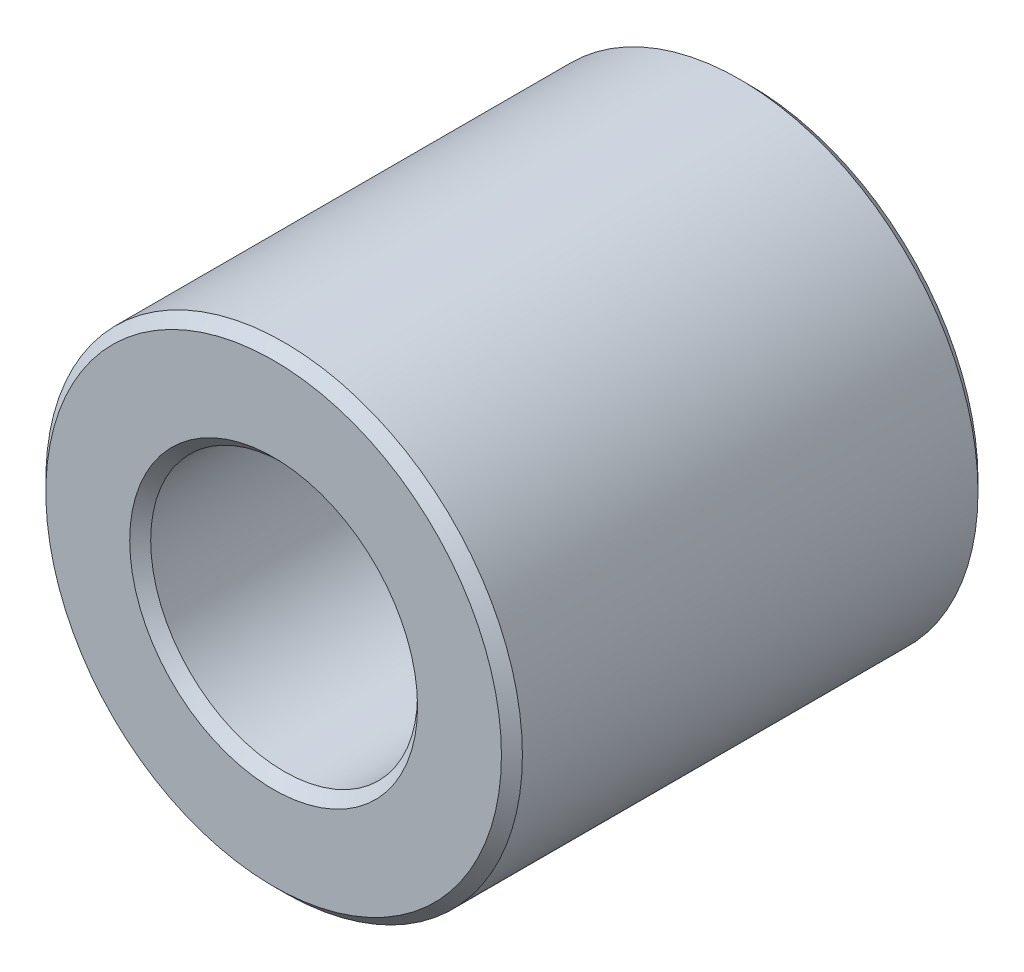
ISO-10303-21;
HEADER;
FILE_DESCRIPTION(('STEP AP214'),'2;1');
FILE_NAME('part.step','',(''),(''),'','','');
FILE_SCHEMA(('AUTOMOTIVE_DESIGN { 1 0 10303 214 1 1 1 1 }'));
ENDSEC;
DATA;
#1=APPLICATION_CONTEXT('core data for automotive mechanical design processes');
#2=APPLICATION_PROTOCOL_DEFINITION('international standard','automotive_design',2000,#1);
#3=PRODUCT_CONTEXT('',#1,'mechanical');
#4=PRODUCT('Part','Part','',(#3));
#5=PRODUCT_RELATED_PRODUCT_CATEGORY('part','',(#4));
#6=PRODUCT_DEFINITION_FORMATION('','',#4);
#7=PRODUCT_DEFINITION_CONTEXT('part definition',#1,'design');
#8=PRODUCT_DEFINITION('design','',#6,#7);
#9=PRODUCT_DEFINITION_SHAPE('','',#8);
#10=(LENGTH_UNIT() NAMED_UNIT(*) SI_UNIT(.MILLI.,.METRE.));
#11=(NAMED_UNIT(*) PLANE_ANGLE_UNIT() SI_UNIT($,.RADIAN.));
#12=(NAMED_UNIT(*) SI_UNIT($,.STERADIAN.) SOLID_ANGLE_UNIT());
#13=UNCERTAINTY_MEASURE_WITH_UNIT(LENGTH_MEASURE(1.E-05),#10,'distance_accuracy_value','');
#14=(GEOMETRIC_REPRESENTATION_CONTEXT(3) GLOBAL_UNCERTAINTY_ASSIGNED_CONTEXT((#13)) GLOBAL_UNIT_ASSIGNED_CONTEXT((#10,
#11,#12)) REPRESENTATION_CONTEXT('',''));
#15=CARTESIAN_POINT('',(0.,0.,0.));
#16=DIRECTION('',(0.,0.,1.));
#17=DIRECTION('',(1.,0.,0.));
#18=AXIS2_PLACEMENT_3D('',#15,#16,#17);
#19=CARTESIAN_POINT('',(0.,0.,-3.175));
#20=DIRECTION('',(0.,0.,1.));
#21=DIRECTION('',(1.,0.,0.));
#22=AXIS2_PLACEMENT_3D('',#19,#20,#21);
#23=CYLINDRICAL_SURFACE('',#22,3.175);
#24=CARTESIAN_POINT('',(0.,0.,3.0353));
#25=DIRECTION('',(0.,0.,1.));
#26=DIRECTION('',(1.,0.,0.));
#27=AXIS2_PLACEMENT_3D('',#24,#25,#26);
#28=CIRCLE('',#27,3.175);
#29=CARTESIAN_POINT('',(3.175,0.,3.0353));
#30=VERTEX_POINT('',#29);
#31=EDGE_CURVE('E50',#30,#30,#28,.F.);
#32=ORIENTED_EDGE('',*,*,#31,.T.);
#33=EDGE_LOOP('',(#32));
#34=FACE_BOUND('',#33,.T.);
#35=CARTESIAN_POINT('',(0.,0.,-3.0353));
#36=DIRECTION('',(0.,0.,1.));
#37=DIRECTION('',(1.,0.,0.));
#38=AXIS2_PLACEMENT_3D('',#35,#36,#37);
#39=CIRCLE('',#38,3.175);
#40=CARTESIAN_POINT('',(3.175,0.,-3.0353));
#41=VERTEX_POINT('',#40);
#42=EDGE_CURVE('E53',#41,#41,#39,.T.);
#43=ORIENTED_EDGE('',*,*,#42,.T.);
#44=EDGE_LOOP('',(#43));
#45=FACE_BOUND('',#44,.T.);
#46=ADVANCED_FACE('F30',(#34,#45),#23,.T.);
#47=CARTESIAN_POINT('',(0.,0.,-3.175));
#48=DIRECTION('',(0.,0.,1.));
#49=DIRECTION('',(1.,0.,0.));
#50=AXIS2_PLACEMENT_3D('',#47,#48,#49);
#51=PLANE('',#50);
#52=CARTESIAN_POINT('',(0.,0.,-3.175));
#53=DIRECTION('',(0.,0.,1.));
#54=DIRECTION('',(1.,0.,0.));
#55=AXIS2_PLACEMENT_3D('',#52,#53,#54);
#56=CIRCLE('',#55,3.0353);
#57=CARTESIAN_POINT('',(3.0353,0.,-3.175));
#58=VERTEX_POINT('',#57);
#59=EDGE_CURVE('E41',#58,#58,#56,.F.);
#60=ORIENTED_EDGE('',*,*,#59,.T.);
#61=EDGE_LOOP('',(#60));
#62=FACE_BOUND('',#61,.T.);
#63=CARTESIAN_POINT('',(0.,0.,-3.175));
#64=DIRECTION('',(0.,0.,1.));
#65=DIRECTION('',(1.,0.,0.));
#66=AXIS2_PLACEMENT_3D('',#63,#64,#65);
#67=CIRCLE('',#66,1.9177);
#68=CARTESIAN_POINT('',(1.9177,0.,-3.175));
#69=VERTEX_POINT('',#68);
#70=EDGE_CURVE('E45',#69,#69,#67,.T.);
#71=ORIENTED_EDGE('',*,*,#70,.T.);
#72=EDGE_LOOP('',(#71));
#73=FACE_BOUND('',#72,.T.);
#74=ADVANCED_FACE('F78',(#62,#73),#51,.F.);
#75=CARTESIAN_POINT('',(0.,0.,-3.175));
#76=DIRECTION('',(0.,0.,1.));
#77=DIRECTION('',(1.,0.,0.));
#78=AXIS2_PLACEMENT_3D('',#75,#76,#77);
#79=CYLINDRICAL_SURFACE('',#78,1.778);
#80=CARTESIAN_POINT('',(0.,0.,3.0353));
#81=DIRECTION('',(0.,0.,1.));
#82=DIRECTION('',(1.,0.,0.));
#83=AXIS2_PLACEMENT_3D('',#80,#81,#82);
#84=CIRCLE('',#83,1.778);
#85=CARTESIAN_POINT('',(1.778,0.,3.0353));
#86=VERTEX_POINT('',#85);
#87=EDGE_CURVE('E10',#86,#86,#84,.T.);
#88=ORIENTED_EDGE('',*,*,#87,.T.);
#89=EDGE_LOOP('',(#88));
#90=FACE_BOUND('',#89,.T.);
#91=CARTESIAN_POINT('',(0.,0.,-3.0353));
#92=DIRECTION('',(0.,0.,1.));
#93=DIRECTION('',(1.,0.,0.));
#94=AXIS2_PLACEMENT_3D('',#91,#92,#93);
#95=CIRCLE('',#94,1.778);
#96=CARTESIAN_POINT('',(1.778,0.,-3.0353));
#97=VERTEX_POINT('',#96);
#98=EDGE_CURVE('E37',#97,#97,#95,.F.);
#99=ORIENTED_EDGE('',*,*,#98,.T.);
#100=EDGE_LOOP('',(#99));
#101=FACE_BOUND('',#100,.T.);
#102=ADVANCED_FACE('F84',(#90,#101),#79,.F.);
#103=CARTESIAN_POINT('',(0.,0.,3.175));
#104=DIRECTION('',(0.,0.,1.));
#105=DIRECTION('',(1.,0.,0.));
#106=AXIS2_PLACEMENT_3D('',#103,#104,#105);
#107=PLANE('',#106);
#108=CARTESIAN_POINT('',(0.,0.,3.175));
#109=DIRECTION('',(0.,0.,1.));
#110=DIRECTION('',(1.,0.,0.));
#111=AXIS2_PLACEMENT_3D('',#108,#109,#110);
#112=CIRCLE('',#111,3.0353);
#113=CARTESIAN_POINT('',(3.0353,0.,3.175));
#114=VERTEX_POINT('',#113);
#115=EDGE_CURVE('E56',#114,#114,#112,.T.);
#116=ORIENTED_EDGE('',*,*,#115,.T.);
#117=EDGE_LOOP('',(#116));
#118=FACE_BOUND('',#117,.T.);
#119=CARTESIAN_POINT('',(0.,0.,3.175));
#120=DIRECTION('',(0.,0.,1.));
#121=DIRECTION('',(1.,0.,0.));
#122=AXIS2_PLACEMENT_3D('',#119,#120,#121);
#123=CIRCLE('',#122,1.9177);
#124=CARTESIAN_POINT('',(1.9177,0.,3.175));
#125=VERTEX_POINT('',#124);
#126=EDGE_CURVE('E59',#125,#125,#123,.F.);
#127=ORIENTED_EDGE('',*,*,#126,.T.);
#128=EDGE_LOOP('',(#127));
#129=FACE_BOUND('',#128,.T.);
#130=ADVANCED_FACE('F63',(#118,#129),#107,.T.);
#131=CARTESIAN_POINT('',(0.,0.,3.175));
#132=DIRECTION('',(0.,0.,-1.));
#133=DIRECTION('',(-1.,0.,0.));
#134=AXIS2_PLACEMENT_3D('',#131,#132,#133);
#135=CONICAL_SURFACE('',#134,3.0353,0.785398163397445);
#136=ORIENTED_EDGE('',*,*,#31,.F.);
#137=EDGE_LOOP('',(#136));
#138=FACE_BOUND('',#137,.T.);
#139=ORIENTED_EDGE('',*,*,#115,.F.);
#140=EDGE_LOOP('',(#139));
#141=FACE_BOUND('',#140,.T.);
#142=ADVANCED_FACE('F74',(#138,#141),#135,.T.);
#143=CARTESIAN_POINT('',(0.,0.,-3.0353));
#144=DIRECTION('',(0.,0.,1.));
#145=DIRECTION('',(1.,0.,0.));
#146=AXIS2_PLACEMENT_3D('',#143,#144,#145);
#147=CONICAL_SURFACE('',#146,3.175,0.785398163397453);
#148=ORIENTED_EDGE('',*,*,#59,.F.);
#149=EDGE_LOOP('',(#148));
#150=FACE_BOUND('',#149,.T.);
#151=ORIENTED_EDGE('',*,*,#42,.F.);
#152=EDGE_LOOP('',(#151));
#153=FACE_BOUND('',#152,.T.);
#154=ADVANCED_FACE('F68',(#150,#153),#147,.T.);
#155=CARTESIAN_POINT('',(0.,0.,3.0353));
#156=DIRECTION('',(0.,0.,1.));
#157=DIRECTION('',(1.,0.,0.));
#158=AXIS2_PLACEMENT_3D('',#155,#156,#157);
#159=CONICAL_SURFACE('',#158,1.778,0.785398163397445);
#160=ORIENTED_EDGE('',*,*,#126,.F.);
#161=EDGE_LOOP('',(#160));
#162=FACE_BOUND('',#161,.T.);
#163=ORIENTED_EDGE('',*,*,#87,.F.);
#164=EDGE_LOOP('',(#163));
#165=FACE_BOUND('',#164,.T.);
#166=ADVANCED_FACE('F65',(#162,#165),#159,.F.);
#167=CARTESIAN_POINT('',(0.,0.,-3.175));
#168=DIRECTION('',(0.,0.,-1.));
#169=DIRECTION('',(-1.,0.,0.));
#170=AXIS2_PLACEMENT_3D('',#167,#168,#169);
#171=CONICAL_SURFACE('',#170,1.9177,0.785398163397445);
#172=ORIENTED_EDGE('',*,*,#98,.F.);
#173=EDGE_LOOP('',(#172));
#174=FACE_BOUND('',#173,.T.);
#175=ORIENTED_EDGE('',*,*,#70,.F.);
#176=EDGE_LOOP('',(#175));
#177=FACE_BOUND('',#176,.T.);
#178=ADVANCED_FACE('F32',(#174,#177),#171,.F.);
#179=CLOSED_SHELL('',(#46,#74,#102,#130,#142,#154,#166,#178));
#180=MANIFOLD_SOLID_BREP('B2',#179);
#181=ADVANCED_BREP_SHAPE_REPRESENTATION('',(#18,#180),#14);
#182=SHAPE_DEFINITION_REPRESENTATION(#9,#181);
ENDSEC;
END-ISO-10303-21;
